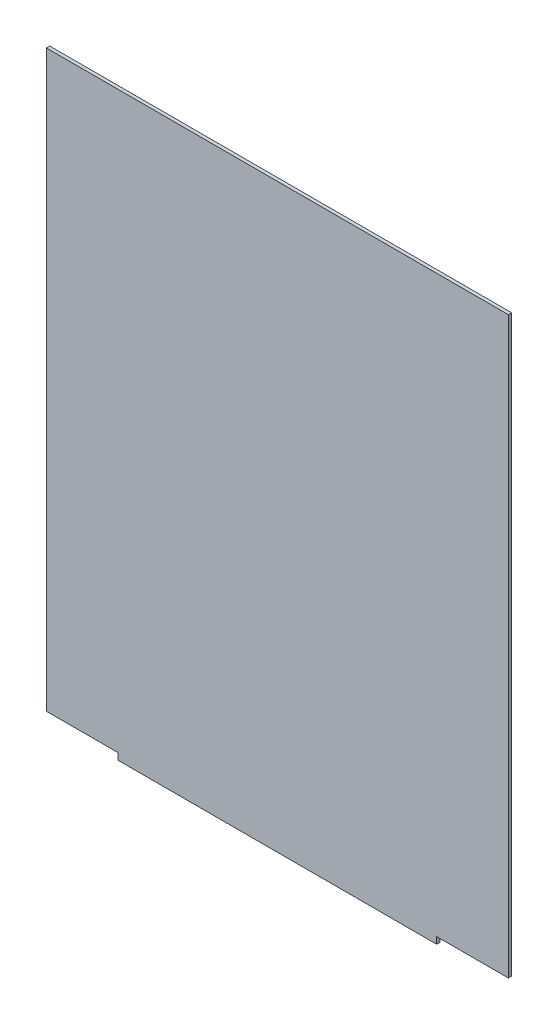
ISO-10303-21;
HEADER;
FILE_DESCRIPTION(('STEP AP214'),'2;1');
FILE_NAME('part.step','',(''),(''),'','','');
FILE_SCHEMA(('AUTOMOTIVE_DESIGN { 1 0 10303 214 1 1 1 1 }'));
ENDSEC;
DATA;
#1=APPLICATION_CONTEXT('core data for automotive mechanical design processes');
#2=APPLICATION_PROTOCOL_DEFINITION('international standard','automotive_design',2000,#1);
#3=PRODUCT_CONTEXT('',#1,'mechanical');
#4=PRODUCT('Part','Part','',(#3));
#5=PRODUCT_RELATED_PRODUCT_CATEGORY('part','',(#4));
#6=PRODUCT_DEFINITION_FORMATION('','',#4);
#7=PRODUCT_DEFINITION_CONTEXT('part definition',#1,'design');
#8=PRODUCT_DEFINITION('design','',#6,#7);
#9=PRODUCT_DEFINITION_SHAPE('','',#8);
#10=(LENGTH_UNIT() NAMED_UNIT(*) SI_UNIT(.MILLI.,.METRE.));
#11=(NAMED_UNIT(*) PLANE_ANGLE_UNIT() SI_UNIT($,.RADIAN.));
#12=(NAMED_UNIT(*) SI_UNIT($,.STERADIAN.) SOLID_ANGLE_UNIT());
#13=UNCERTAINTY_MEASURE_WITH_UNIT(LENGTH_MEASURE(1.E-05),#10,'distance_accuracy_value','');
#14=(GEOMETRIC_REPRESENTATION_CONTEXT(3) GLOBAL_UNCERTAINTY_ASSIGNED_CONTEXT((#13)) GLOBAL_UNIT_ASSIGNED_CONTEXT((#10,
#11,#12)) REPRESENTATION_CONTEXT('',''));
#15=CARTESIAN_POINT('',(0.,0.,0.));
#16=DIRECTION('',(0.,0.,1.));
#17=DIRECTION('',(1.,0.,0.));
#18=AXIS2_PLACEMENT_3D('',#15,#16,#17);
#19=CARTESIAN_POINT('',(209.5,-263.5,3.));
#20=DIRECTION('',(-1.,0.,0.));
#21=DIRECTION('',(0.,0.,1.));
#22=AXIS2_PLACEMENT_3D('',#19,#20,#21);
#23=PLANE('',#22);
#24=DIRECTION('',(0.,0.,1.));
#25=VECTOR('',#24,1.);
#26=CARTESIAN_POINT('',(209.5,-257.5,-65.2763356814705));
#27=LINE('',#26,#25);
#28=CARTESIAN_POINT('',(209.5,-257.5,0.));
#29=VERTEX_POINT('',#28);
#30=CARTESIAN_POINT('',(209.5,-257.5,2.99999999998754));
#31=VERTEX_POINT('',#30);
#32=EDGE_CURVE('E109',#29,#31,#27,.T.);
#33=ORIENTED_EDGE('',*,*,#32,.F.);
#34=DIRECTION('',(0.,1.,0.));
#35=VECTOR('',#34,1.);
#36=CARTESIAN_POINT('',(209.5,-263.5,0.));
#37=LINE('',#36,#35);
#38=CARTESIAN_POINT('',(209.5,263.5,0.));
#39=VERTEX_POINT('',#38);
#40=EDGE_CURVE('E114',#29,#39,#37,.T.);
#41=ORIENTED_EDGE('',*,*,#40,.T.);
#42=DIRECTION('',(0.,0.,-1.));
#43=VECTOR('',#42,1.);
#44=CARTESIAN_POINT('',(209.5,263.5,3.));
#45=LINE('',#44,#43);
#46=CARTESIAN_POINT('',(209.5,263.5,3.));
#47=VERTEX_POINT('',#46);
#48=EDGE_CURVE('E11',#47,#39,#45,.T.);
#49=ORIENTED_EDGE('',*,*,#48,.F.);
#50=DIRECTION('',(0.,1.,0.));
#51=VECTOR('',#50,1.);
#52=CARTESIAN_POINT('',(209.5,-263.5,3.));
#53=LINE('',#52,#51);
#54=EDGE_CURVE('E120',#31,#47,#53,.T.);
#55=ORIENTED_EDGE('',*,*,#54,.F.);
#56=EDGE_LOOP('',(#33,#41,#49,#55));
#57=FACE_BOUND('',#56,.T.);
#58=ADVANCED_FACE('F41',(#57),#23,.F.);
#59=CARTESIAN_POINT('',(-209.5,-263.5,3.));
#60=DIRECTION('',(1.,0.,0.));
#61=DIRECTION('',(0.,0.,-1.));
#62=AXIS2_PLACEMENT_3D('',#59,#60,#61);
#63=PLANE('',#62);
#64=DIRECTION('',(0.,0.,1.));
#65=VECTOR('',#64,1.);
#66=CARTESIAN_POINT('',(-209.5,-257.5,-65.2763356814704));
#67=LINE('',#66,#65);
#68=CARTESIAN_POINT('',(-209.5,-257.5,0.));
#69=VERTEX_POINT('',#68);
#70=CARTESIAN_POINT('',(-209.5,-257.5,2.99999999998763));
#71=VERTEX_POINT('',#70);
#72=EDGE_CURVE('E63',#69,#71,#67,.T.);
#73=ORIENTED_EDGE('',*,*,#72,.T.);
#74=DIRECTION('',(0.,-1.,0.));
#75=VECTOR('',#74,1.);
#76=CARTESIAN_POINT('',(-209.5,-263.5,3.));
#77=LINE('',#76,#75);
#78=CARTESIAN_POINT('',(-209.5,263.5,3.));
#79=VERTEX_POINT('',#78);
#80=EDGE_CURVE('E142',#79,#71,#77,.T.);
#81=ORIENTED_EDGE('',*,*,#80,.F.);
#82=DIRECTION('',(0.,0.,-1.));
#83=VECTOR('',#82,1.);
#84=CARTESIAN_POINT('',(-209.5,263.5,3.));
#85=LINE('',#84,#83);
#86=CARTESIAN_POINT('',(-209.5,263.5,0.));
#87=VERTEX_POINT('',#86);
#88=EDGE_CURVE('E48',#79,#87,#85,.T.);
#89=ORIENTED_EDGE('',*,*,#88,.T.);
#90=DIRECTION('',(0.,-1.,0.));
#91=VECTOR('',#90,1.);
#92=CARTESIAN_POINT('',(-209.5,-263.5,0.));
#93=LINE('',#92,#91);
#94=EDGE_CURVE('E127',#87,#69,#93,.T.);
#95=ORIENTED_EDGE('',*,*,#94,.T.);
#96=EDGE_LOOP('',(#73,#81,#89,#95));
#97=FACE_BOUND('',#96,.T.);
#98=ADVANCED_FACE('F196',(#97),#63,.F.);
#99=CARTESIAN_POINT('',(-209.5,-263.5,3.));
#100=DIRECTION('',(0.,1.,0.));
#101=DIRECTION('',(0.,0.,1.));
#102=AXIS2_PLACEMENT_3D('',#99,#100,#101);
#103=PLANE('',#102);
#104=DIRECTION('',(0.,0.,1.));
#105=VECTOR('',#104,1.);
#106=CARTESIAN_POINT('',(144.5,-263.5,-65.2763356814704));
#107=LINE('',#106,#105);
#108=CARTESIAN_POINT('',(144.5,-263.5,0.));
#109=VERTEX_POINT('',#108);
#110=CARTESIAN_POINT('',(144.5,-263.5,2.99999999998755));
#111=VERTEX_POINT('',#110);
#112=EDGE_CURVE('E166',#109,#111,#107,.T.);
#113=ORIENTED_EDGE('',*,*,#112,.T.);
#114=DIRECTION('',(1.,0.,0.));
#115=VECTOR('',#114,1.);
#116=CARTESIAN_POINT('',(-209.5,-263.5,3.));
#117=LINE('',#116,#115);
#118=CARTESIAN_POINT('',(-144.5,-263.5,2.99999999998761));
#119=VERTEX_POINT('',#118);
#120=EDGE_CURVE('E130',#119,#111,#117,.T.);
#121=ORIENTED_EDGE('',*,*,#120,.F.);
#122=DIRECTION('',(0.,0.,1.));
#123=VECTOR('',#122,1.);
#124=CARTESIAN_POINT('',(-144.5,-263.5,-65.2763356814704));
#125=LINE('',#124,#123);
#126=CARTESIAN_POINT('',(-144.5,-263.5,0.));
#127=VERTEX_POINT('',#126);
#128=EDGE_CURVE('E159',#127,#119,#125,.T.);
#129=ORIENTED_EDGE('',*,*,#128,.F.);
#130=DIRECTION('',(1.,0.,0.));
#131=VECTOR('',#130,1.);
#132=CARTESIAN_POINT('',(-209.5,-263.5,0.));
#133=LINE('',#132,#131);
#134=EDGE_CURVE('E135',#127,#109,#133,.T.);
#135=ORIENTED_EDGE('',*,*,#134,.T.);
#136=EDGE_LOOP('',(#113,#121,#129,#135));
#137=FACE_BOUND('',#136,.T.);
#138=ADVANCED_FACE('F177',(#137),#103,.F.);
#139=CARTESIAN_POINT('',(0.,0.,3.));
#140=DIRECTION('',(0.,0.,-1.));
#141=DIRECTION('',(-1.,0.,0.));
#142=AXIS2_PLACEMENT_3D('',#139,#140,#141);
#143=PLANE('',#142);
#144=DIRECTION('',(0.,1.,0.));
#145=VECTOR('',#144,1.);
#146=CARTESIAN_POINT('',(144.5,-263.5,2.99999999998755));
#147=LINE('',#146,#145);
#148=CARTESIAN_POINT('',(144.5,-257.5,2.99999999998755));
#149=VERTEX_POINT('',#148);
#150=EDGE_CURVE('E168',#111,#149,#147,.T.);
#151=ORIENTED_EDGE('',*,*,#150,.T.);
#152=DIRECTION('',(1.,0.,0.));
#153=VECTOR('',#152,1.);
#154=CARTESIAN_POINT('',(144.5,-257.5,2.99999999998755));
#155=LINE('',#154,#153);
#156=EDGE_CURVE('E121',#149,#31,#155,.T.);
#157=ORIENTED_EDGE('',*,*,#156,.T.);
#158=ORIENTED_EDGE('',*,*,#54,.T.);
#159=DIRECTION('',(-1.,0.,0.));
#160=VECTOR('',#159,1.);
#161=CARTESIAN_POINT('',(-209.5,263.5,3.));
#162=LINE('',#161,#160);
#163=EDGE_CURVE('E148',#47,#79,#162,.T.);
#164=ORIENTED_EDGE('',*,*,#163,.T.);
#165=ORIENTED_EDGE('',*,*,#80,.T.);
#166=DIRECTION('',(1.,0.,0.));
#167=VECTOR('',#166,1.);
#168=CARTESIAN_POINT('',(-144.5,-257.5,2.99999999998761));
#169=LINE('',#168,#167);
#170=CARTESIAN_POINT('',(-144.5,-257.5,2.99999999998761));
#171=VERTEX_POINT('',#170);
#172=EDGE_CURVE('E153',#71,#171,#169,.T.);
#173=ORIENTED_EDGE('',*,*,#172,.T.);
#174=DIRECTION('',(0.,-1.,0.));
#175=VECTOR('',#174,1.);
#176=CARTESIAN_POINT('',(-144.5,-263.5,2.99999999998761));
#177=LINE('',#176,#175);
#178=EDGE_CURVE('E156',#171,#119,#177,.T.);
#179=ORIENTED_EDGE('',*,*,#178,.T.);
#180=ORIENTED_EDGE('',*,*,#120,.T.);
#181=EDGE_LOOP('',(#151,#157,#158,#164,#165,#173,#179,#180));
#182=FACE_BOUND('',#181,.T.);
#183=ADVANCED_FACE('F173',(#182),#143,.F.);
#184=CARTESIAN_POINT('',(0.,0.,0.));
#185=DIRECTION('',(0.,0.,-1.));
#186=DIRECTION('',(-1.,0.,0.));
#187=AXIS2_PLACEMENT_3D('',#184,#185,#186);
#188=PLANE('',#187);
#189=DIRECTION('',(1.,0.,0.));
#190=VECTOR('',#189,1.);
#191=CARTESIAN_POINT('',(144.5,-257.5,0.));
#192=LINE('',#191,#190);
#193=CARTESIAN_POINT('',(144.5,-257.5,0.));
#194=VERTEX_POINT('',#193);
#195=EDGE_CURVE('E105',#194,#29,#192,.T.);
#196=ORIENTED_EDGE('',*,*,#195,.F.);
#197=DIRECTION('',(0.,1.,0.));
#198=VECTOR('',#197,1.);
#199=CARTESIAN_POINT('',(144.5,-263.5,0.));
#200=LINE('',#199,#198);
#201=EDGE_CURVE('E55',#109,#194,#200,.T.);
#202=ORIENTED_EDGE('',*,*,#201,.F.);
#203=ORIENTED_EDGE('',*,*,#134,.F.);
#204=DIRECTION('',(0.,-1.,0.));
#205=VECTOR('',#204,1.);
#206=CARTESIAN_POINT('',(-144.5,-263.5,0.));
#207=LINE('',#206,#205);
#208=CARTESIAN_POINT('',(-144.5,-257.5,0.));
#209=VERTEX_POINT('',#208);
#210=EDGE_CURVE('E160',#209,#127,#207,.T.);
#211=ORIENTED_EDGE('',*,*,#210,.F.);
#212=DIRECTION('',(1.,0.,0.));
#213=VECTOR('',#212,1.);
#214=CARTESIAN_POINT('',(-144.5,-257.5,0.));
#215=LINE('',#214,#213);
#216=EDGE_CURVE('E155',#69,#209,#215,.T.);
#217=ORIENTED_EDGE('',*,*,#216,.F.);
#218=ORIENTED_EDGE('',*,*,#94,.F.);
#219=DIRECTION('',(-1.,0.,0.));
#220=VECTOR('',#219,1.);
#221=CARTESIAN_POINT('',(-209.5,263.5,0.));
#222=LINE('',#221,#220);
#223=EDGE_CURVE('E125',#39,#87,#222,.T.);
#224=ORIENTED_EDGE('',*,*,#223,.F.);
#225=ORIENTED_EDGE('',*,*,#40,.F.);
#226=EDGE_LOOP('',(#196,#202,#203,#211,#217,#218,#224,#225));
#227=FACE_BOUND('',#226,.T.);
#228=ADVANCED_FACE('F123',(#227),#188,.T.);
#229=CARTESIAN_POINT('',(-209.5,263.5,3.));
#230=DIRECTION('',(0.,-1.,0.));
#231=DIRECTION('',(0.,0.,-1.));
#232=AXIS2_PLACEMENT_3D('',#229,#230,#231);
#233=PLANE('',#232);
#234=ORIENTED_EDGE('',*,*,#223,.T.);
#235=ORIENTED_EDGE('',*,*,#88,.F.);
#236=ORIENTED_EDGE('',*,*,#163,.F.);
#237=ORIENTED_EDGE('',*,*,#48,.T.);
#238=EDGE_LOOP('',(#234,#235,#236,#237));
#239=FACE_BOUND('',#238,.T.);
#240=ADVANCED_FACE('F192',(#239),#233,.F.);
#241=CARTESIAN_POINT('',(-144.5,-263.5,-65.2763356814704));
#242=DIRECTION('',(-1.,0.,0.));
#243=DIRECTION('',(0.,0.,1.));
#244=AXIS2_PLACEMENT_3D('',#241,#242,#243);
#245=PLANE('',#244);
#246=ORIENTED_EDGE('',*,*,#210,.T.);
#247=ORIENTED_EDGE('',*,*,#128,.T.);
#248=ORIENTED_EDGE('',*,*,#178,.F.);
#249=DIRECTION('',(0.,0.,1.));
#250=VECTOR('',#249,1.);
#251=CARTESIAN_POINT('',(-144.5,-257.5,-65.2763356814704));
#252=LINE('',#251,#250);
#253=EDGE_CURVE('E158',#209,#171,#252,.T.);
#254=ORIENTED_EDGE('',*,*,#253,.F.);
#255=EDGE_LOOP('',(#246,#247,#248,#254));
#256=FACE_BOUND('',#255,.T.);
#257=ADVANCED_FACE('F182',(#256),#245,.T.);
#258=CARTESIAN_POINT('',(-144.5,-257.5,-65.2763356814704));
#259=DIRECTION('',(0.,-1.,0.));
#260=DIRECTION('',(0.,0.,-1.));
#261=AXIS2_PLACEMENT_3D('',#258,#259,#260);
#262=PLANE('',#261);
#263=ORIENTED_EDGE('',*,*,#216,.T.);
#264=ORIENTED_EDGE('',*,*,#253,.T.);
#265=ORIENTED_EDGE('',*,*,#172,.F.);
#266=ORIENTED_EDGE('',*,*,#72,.F.);
#267=EDGE_LOOP('',(#263,#264,#265,#266));
#268=FACE_BOUND('',#267,.T.);
#269=ADVANCED_FACE('F184',(#268),#262,.T.);
#270=CARTESIAN_POINT('',(144.5,-263.5,-65.2763356814704));
#271=DIRECTION('',(1.,0.,0.));
#272=DIRECTION('',(0.,1.,0.));
#273=AXIS2_PLACEMENT_3D('',#270,#271,#272);
#274=PLANE('',#273);
#275=ORIENTED_EDGE('',*,*,#201,.T.);
#276=DIRECTION('',(0.,0.,1.));
#277=VECTOR('',#276,1.);
#278=CARTESIAN_POINT('',(144.5,-257.5,-65.2763356814704));
#279=LINE('',#278,#277);
#280=EDGE_CURVE('E111',#194,#149,#279,.T.);
#281=ORIENTED_EDGE('',*,*,#280,.T.);
#282=ORIENTED_EDGE('',*,*,#150,.F.);
#283=ORIENTED_EDGE('',*,*,#112,.F.);
#284=EDGE_LOOP('',(#275,#281,#282,#283));
#285=FACE_BOUND('',#284,.T.);
#286=ADVANCED_FACE('F175',(#285),#274,.T.);
#287=CARTESIAN_POINT('',(144.5,-257.5,-65.2763356814704));
#288=DIRECTION('',(0.,-1.,0.));
#289=DIRECTION('',(0.,0.,-1.));
#290=AXIS2_PLACEMENT_3D('',#287,#288,#289);
#291=PLANE('',#290);
#292=ORIENTED_EDGE('',*,*,#195,.T.);
#293=ORIENTED_EDGE('',*,*,#32,.T.);
#294=ORIENTED_EDGE('',*,*,#156,.F.);
#295=ORIENTED_EDGE('',*,*,#280,.F.);
#296=EDGE_LOOP('',(#292,#293,#294,#295));
#297=FACE_BOUND('',#296,.T.);
#298=ADVANCED_FACE('F107',(#297),#291,.T.);
#299=CLOSED_SHELL('',(#58,#98,#138,#183,#228,#240,#257,#269,#286,#298));
#300=MANIFOLD_SOLID_BREP('B2',#299);
#301=ADVANCED_BREP_SHAPE_REPRESENTATION('',(#18,#300),#14);
#302=SHAPE_DEFINITION_REPRESENTATION(#9,#301);
ENDSEC;
END-ISO-10303-21;
